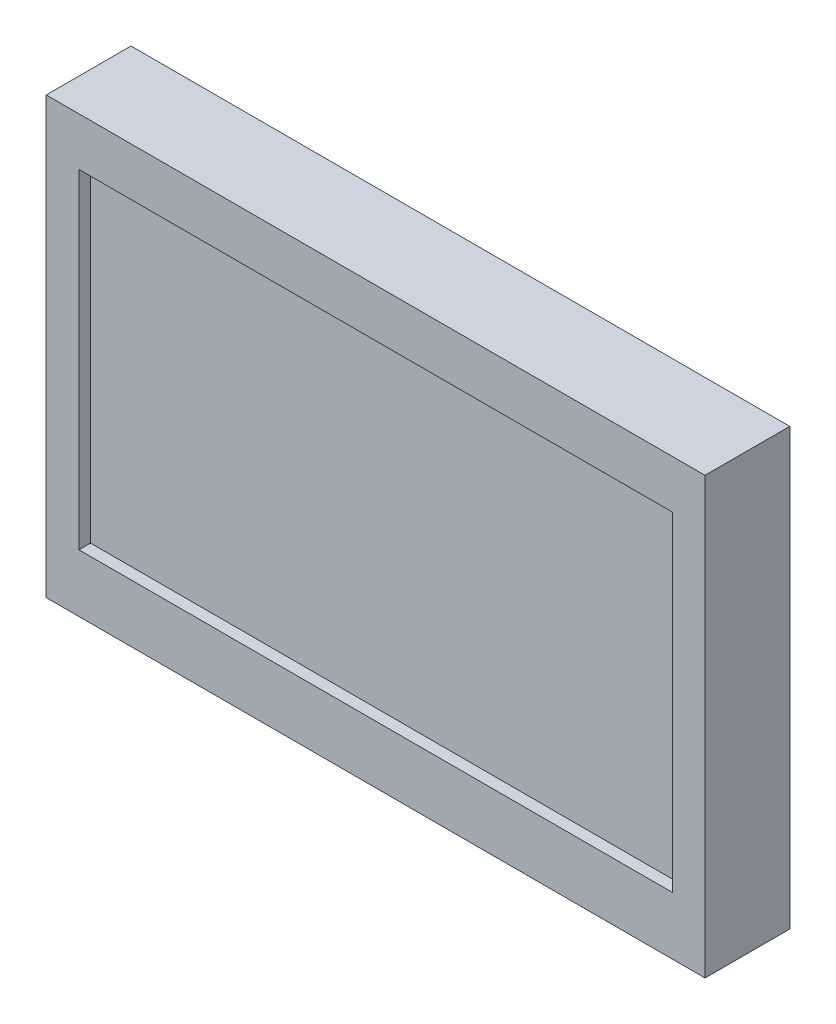
ISO-10303-21;
HEADER;
FILE_DESCRIPTION(('STEP AP214'),'2;1');
FILE_NAME('part.step','',(''),(''),'','','');
FILE_SCHEMA(('AUTOMOTIVE_DESIGN { 1 0 10303 214 1 1 1 1 }'));
ENDSEC;
DATA;
#1=APPLICATION_CONTEXT('core data for automotive mechanical design processes');
#2=APPLICATION_PROTOCOL_DEFINITION('international standard','automotive_design',2000,#1);
#3=PRODUCT_CONTEXT('',#1,'mechanical');
#4=PRODUCT('Part','Part','',(#3));
#5=PRODUCT_RELATED_PRODUCT_CATEGORY('part','',(#4));
#6=PRODUCT_DEFINITION_FORMATION('','',#4);
#7=PRODUCT_DEFINITION_CONTEXT('part definition',#1,'design');
#8=PRODUCT_DEFINITION('design','',#6,#7);
#9=PRODUCT_DEFINITION_SHAPE('','',#8);
#10=(LENGTH_UNIT() NAMED_UNIT(*) SI_UNIT(.MILLI.,.METRE.));
#11=(NAMED_UNIT(*) PLANE_ANGLE_UNIT() SI_UNIT($,.RADIAN.));
#12=(NAMED_UNIT(*) SI_UNIT($,.STERADIAN.) SOLID_ANGLE_UNIT());
#13=UNCERTAINTY_MEASURE_WITH_UNIT(LENGTH_MEASURE(1.E-05),#10,'distance_accuracy_value','');
#14=(GEOMETRIC_REPRESENTATION_CONTEXT(3) GLOBAL_UNCERTAINTY_ASSIGNED_CONTEXT((#13)) GLOBAL_UNIT_ASSIGNED_CONTEXT((#10,
#11,#12)) REPRESENTATION_CONTEXT('',''));
#15=CARTESIAN_POINT('',(0.,0.,0.));
#16=DIRECTION('',(0.,0.,1.));
#17=DIRECTION('',(1.,0.,0.));
#18=AXIS2_PLACEMENT_3D('',#15,#16,#17);
#19=CARTESIAN_POINT('',(0.,0.,22.));
#20=DIRECTION('',(0.,0.,1.));
#21=DIRECTION('',(1.,0.,0.));
#22=AXIS2_PLACEMENT_3D('',#19,#20,#21);
#23=PLANE('',#22);
#24=DIRECTION('',(0.,-1.,0.));
#25=VECTOR('',#24,1.);
#26=CARTESIAN_POINT('',(-85.5,-56.5,22.));
#27=LINE('',#26,#25);
#28=CARTESIAN_POINT('',(-85.5,56.5,22.));
#29=VERTEX_POINT('',#28);
#30=CARTESIAN_POINT('',(-85.5,-56.5,22.));
#31=VERTEX_POINT('',#30);
#32=EDGE_CURVE('E151',#29,#31,#27,.T.);
#33=ORIENTED_EDGE('',*,*,#32,.T.);
#34=DIRECTION('',(1.,0.,0.));
#35=VECTOR('',#34,1.);
#36=CARTESIAN_POINT('',(85.5,-56.5,22.));
#37=LINE('',#36,#35);
#38=CARTESIAN_POINT('',(85.5,-56.5,22.));
#39=VERTEX_POINT('',#38);
#40=EDGE_CURVE('E88',#31,#39,#37,.T.);
#41=ORIENTED_EDGE('',*,*,#40,.T.);
#42=DIRECTION('',(0.,1.,0.));
#43=VECTOR('',#42,1.);
#44=CARTESIAN_POINT('',(85.5,-56.5,22.));
#45=LINE('',#44,#43);
#46=CARTESIAN_POINT('',(85.5,56.5,22.));
#47=VERTEX_POINT('',#46);
#48=EDGE_CURVE('E154',#39,#47,#45,.T.);
#49=ORIENTED_EDGE('',*,*,#48,.T.);
#50=DIRECTION('',(-1.,0.,0.));
#51=VECTOR('',#50,1.);
#52=CARTESIAN_POINT('',(85.5,56.5,22.));
#53=LINE('',#52,#51);
#54=EDGE_CURVE('E60',#47,#29,#53,.T.);
#55=ORIENTED_EDGE('',*,*,#54,.T.);
#56=EDGE_LOOP('',(#33,#41,#49,#55));
#57=FACE_BOUND('',#56,.T.);
#58=DIRECTION('',(0.,1.,0.));
#59=VECTOR('',#58,1.);
#60=CARTESIAN_POINT('',(77.,0.,22.));
#61=LINE('',#60,#59);
#62=CARTESIAN_POINT('',(77.,-41.5,22.));
#63=VERTEX_POINT('',#62);
#64=CARTESIAN_POINT('',(77.,44.,22.));
#65=VERTEX_POINT('',#64);
#66=EDGE_CURVE('E137',#63,#65,#61,.T.);
#67=ORIENTED_EDGE('',*,*,#66,.F.);
#68=DIRECTION('',(-1.,0.,0.));
#69=VECTOR('',#68,1.);
#70=CARTESIAN_POINT('',(0.,-41.5,22.));
#71=LINE('',#70,#69);
#72=CARTESIAN_POINT('',(-77.,-41.5,22.));
#73=VERTEX_POINT('',#72);
#74=EDGE_CURVE('E51',#63,#73,#71,.T.);
#75=ORIENTED_EDGE('',*,*,#74,.T.);
#76=DIRECTION('',(0.,1.,0.));
#77=VECTOR('',#76,1.);
#78=CARTESIAN_POINT('',(-77.,0.,22.));
#79=LINE('',#78,#77);
#80=CARTESIAN_POINT('',(-77.,44.,22.));
#81=VERTEX_POINT('',#80);
#82=EDGE_CURVE('E126',#73,#81,#79,.T.);
#83=ORIENTED_EDGE('',*,*,#82,.T.);
#84=DIRECTION('',(-1.,0.,0.));
#85=VECTOR('',#84,1.);
#86=CARTESIAN_POINT('',(0.,44.,22.));
#87=LINE('',#86,#85);
#88=EDGE_CURVE('E140',#65,#81,#87,.T.);
#89=ORIENTED_EDGE('',*,*,#88,.F.);
#90=EDGE_LOOP('',(#67,#75,#83,#89));
#91=FACE_BOUND('',#90,.T.);
#92=ADVANCED_FACE('F36',(#57,#91),#23,.T.);
#93=CARTESIAN_POINT('',(-85.5,-56.5,22.));
#94=DIRECTION('',(1.,0.,0.));
#95=DIRECTION('',(0.,0.,-1.));
#96=AXIS2_PLACEMENT_3D('',#93,#94,#95);
#97=PLANE('',#96);
#98=DIRECTION('',(0.,-1.,0.));
#99=VECTOR('',#98,1.);
#100=CARTESIAN_POINT('',(-85.5,-56.5,0.));
#101=LINE('',#100,#99);
#102=CARTESIAN_POINT('',(-85.5,56.5,0.));
#103=VERTEX_POINT('',#102);
#104=CARTESIAN_POINT('',(-85.5,-56.5,0.));
#105=VERTEX_POINT('',#104);
#106=EDGE_CURVE('E147',#103,#105,#101,.T.);
#107=ORIENTED_EDGE('',*,*,#106,.T.);
#108=DIRECTION('',(0.,0.,-1.));
#109=VECTOR('',#108,1.);
#110=CARTESIAN_POINT('',(-85.5,-56.5,22.));
#111=LINE('',#110,#109);
#112=EDGE_CURVE('E11',#31,#105,#111,.T.);
#113=ORIENTED_EDGE('',*,*,#112,.F.);
#114=ORIENTED_EDGE('',*,*,#32,.F.);
#115=DIRECTION('',(0.,0.,-1.));
#116=VECTOR('',#115,1.);
#117=CARTESIAN_POINT('',(-85.5,56.5,22.));
#118=LINE('',#117,#116);
#119=EDGE_CURVE('E157',#29,#103,#118,.T.);
#120=ORIENTED_EDGE('',*,*,#119,.T.);
#121=EDGE_LOOP('',(#107,#113,#114,#120));
#122=FACE_BOUND('',#121,.T.);
#123=ADVANCED_FACE('F38',(#122),#97,.F.);
#124=CARTESIAN_POINT('',(85.5,-56.5,22.));
#125=DIRECTION('',(0.,1.,0.));
#126=DIRECTION('',(-1.,0.,0.));
#127=AXIS2_PLACEMENT_3D('',#124,#125,#126);
#128=PLANE('',#127);
#129=CARTESIAN_POINT('',(0.,-56.5,8.50000000000001));
#130=DIRECTION('',(0.,-1.,0.));
#131=DIRECTION('',(1.,0.,0.));
#132=AXIS2_PLACEMENT_3D('',#129,#130,#131);
#133=CIRCLE('',#132,2.75);
#134=CARTESIAN_POINT('',(2.75000000000001,-56.5,8.50000000000001));
#135=VERTEX_POINT('',#134);
#136=EDGE_CURVE('E221',#135,#135,#133,.T.);
#137=ORIENTED_EDGE('',*,*,#136,.F.);
#138=EDGE_LOOP('',(#137));
#139=FACE_BOUND('',#138,.T.);
#140=DIRECTION('',(1.,0.,0.));
#141=VECTOR('',#140,1.);
#142=CARTESIAN_POINT('',(85.5,-56.5,0.));
#143=LINE('',#142,#141);
#144=CARTESIAN_POINT('',(85.5,-56.5,0.));
#145=VERTEX_POINT('',#144);
#146=EDGE_CURVE('E160',#105,#145,#143,.T.);
#147=ORIENTED_EDGE('',*,*,#146,.T.);
#148=DIRECTION('',(0.,0.,-1.));
#149=VECTOR('',#148,1.);
#150=CARTESIAN_POINT('',(85.5,-56.5,22.));
#151=LINE('',#150,#149);
#152=EDGE_CURVE('E44',#39,#145,#151,.T.);
#153=ORIENTED_EDGE('',*,*,#152,.F.);
#154=ORIENTED_EDGE('',*,*,#40,.F.);
#155=ORIENTED_EDGE('',*,*,#112,.T.);
#156=EDGE_LOOP('',(#147,#153,#154,#155));
#157=FACE_BOUND('',#156,.T.);
#158=ADVANCED_FACE('F187',(#139,#157),#128,.F.);
#159=CARTESIAN_POINT('',(85.5,-56.5,22.));
#160=DIRECTION('',(-1.,0.,0.));
#161=DIRECTION('',(0.,0.,1.));
#162=AXIS2_PLACEMENT_3D('',#159,#160,#161);
#163=PLANE('',#162);
#164=DIRECTION('',(0.,1.,0.));
#165=VECTOR('',#164,1.);
#166=CARTESIAN_POINT('',(85.5,-56.5,0.));
#167=LINE('',#166,#165);
#168=CARTESIAN_POINT('',(85.5,56.5,0.));
#169=VERTEX_POINT('',#168);
#170=EDGE_CURVE('E162',#145,#169,#167,.T.);
#171=ORIENTED_EDGE('',*,*,#170,.T.);
#172=DIRECTION('',(0.,0.,-1.));
#173=VECTOR('',#172,1.);
#174=CARTESIAN_POINT('',(85.5,56.5,22.));
#175=LINE('',#174,#173);
#176=EDGE_CURVE('E166',#47,#169,#175,.T.);
#177=ORIENTED_EDGE('',*,*,#176,.F.);
#178=ORIENTED_EDGE('',*,*,#48,.F.);
#179=ORIENTED_EDGE('',*,*,#152,.T.);
#180=EDGE_LOOP('',(#171,#177,#178,#179));
#181=FACE_BOUND('',#180,.T.);
#182=ADVANCED_FACE('F171',(#181),#163,.F.);
#183=CARTESIAN_POINT('',(85.5,56.5,22.));
#184=DIRECTION('',(0.,-1.,0.));
#185=DIRECTION('',(1.,0.,0.));
#186=AXIS2_PLACEMENT_3D('',#183,#184,#185);
#187=PLANE('',#186);
#188=DIRECTION('',(-1.,0.,0.));
#189=VECTOR('',#188,1.);
#190=CARTESIAN_POINT('',(85.5,56.5,0.));
#191=LINE('',#190,#189);
#192=EDGE_CURVE('E81',#169,#103,#191,.T.);
#193=ORIENTED_EDGE('',*,*,#192,.T.);
#194=ORIENTED_EDGE('',*,*,#119,.F.);
#195=ORIENTED_EDGE('',*,*,#54,.F.);
#196=ORIENTED_EDGE('',*,*,#176,.T.);
#197=EDGE_LOOP('',(#193,#194,#195,#196));
#198=FACE_BOUND('',#197,.T.);
#199=ADVANCED_FACE('F179',(#198),#187,.F.);
#200=CARTESIAN_POINT('',(0.,0.,0.));
#201=DIRECTION('',(0.,0.,1.));
#202=DIRECTION('',(1.,0.,0.));
#203=AXIS2_PLACEMENT_3D('',#200,#201,#202);
#204=PLANE('',#203);
#205=ORIENTED_EDGE('',*,*,#106,.F.);
#206=ORIENTED_EDGE('',*,*,#192,.F.);
#207=ORIENTED_EDGE('',*,*,#170,.F.);
#208=ORIENTED_EDGE('',*,*,#146,.F.);
#209=EDGE_LOOP('',(#205,#206,#207,#208));
#210=FACE_BOUND('',#209,.T.);
#211=ADVANCED_FACE('F175',(#210),#204,.F.);
#212=CARTESIAN_POINT('',(0.,-41.5,19.));
#213=DIRECTION('',(0.,1.,0.));
#214=DIRECTION('',(0.,0.,1.));
#215=AXIS2_PLACEMENT_3D('',#212,#213,#214);
#216=PLANE('',#215);
#217=ORIENTED_EDGE('',*,*,#74,.F.);
#218=DIRECTION('',(0.,0.,1.));
#219=VECTOR('',#218,1.);
#220=CARTESIAN_POINT('',(77.,-41.5,19.));
#221=LINE('',#220,#219);
#222=CARTESIAN_POINT('',(77.,-41.5,19.));
#223=VERTEX_POINT('',#222);
#224=EDGE_CURVE('E109',#223,#63,#221,.T.);
#225=ORIENTED_EDGE('',*,*,#224,.F.);
#226=DIRECTION('',(-1.,0.,0.));
#227=VECTOR('',#226,1.);
#228=CARTESIAN_POINT('',(0.,-41.5,19.));
#229=LINE('',#228,#227);
#230=CARTESIAN_POINT('',(-77.,-41.5,19.));
#231=VERTEX_POINT('',#230);
#232=EDGE_CURVE('E112',#223,#231,#229,.T.);
#233=ORIENTED_EDGE('',*,*,#232,.T.);
#234=DIRECTION('',(0.,0.,1.));
#235=VECTOR('',#234,1.);
#236=CARTESIAN_POINT('',(-77.,-41.5,19.));
#237=LINE('',#236,#235);
#238=EDGE_CURVE('E145',#231,#73,#237,.T.);
#239=ORIENTED_EDGE('',*,*,#238,.T.);
#240=EDGE_LOOP('',(#217,#225,#233,#239));
#241=FACE_BOUND('',#240,.T.);
#242=ADVANCED_FACE('F111',(#241),#216,.T.);
#243=CARTESIAN_POINT('',(-77.,0.,19.));
#244=DIRECTION('',(1.,0.,0.));
#245=DIRECTION('',(0.,0.,-1.));
#246=AXIS2_PLACEMENT_3D('',#243,#244,#245);
#247=PLANE('',#246);
#248=ORIENTED_EDGE('',*,*,#82,.F.);
#249=ORIENTED_EDGE('',*,*,#238,.F.);
#250=DIRECTION('',(0.,1.,0.));
#251=VECTOR('',#250,1.);
#252=CARTESIAN_POINT('',(-77.,0.,19.));
#253=LINE('',#252,#251);
#254=CARTESIAN_POINT('',(-77.,44.,19.));
#255=VERTEX_POINT('',#254);
#256=EDGE_CURVE('E119',#231,#255,#253,.T.);
#257=ORIENTED_EDGE('',*,*,#256,.T.);
#258=DIRECTION('',(0.,0.,1.));
#259=VECTOR('',#258,1.);
#260=CARTESIAN_POINT('',(-77.,44.,19.));
#261=LINE('',#260,#259);
#262=EDGE_CURVE('E148',#255,#81,#261,.T.);
#263=ORIENTED_EDGE('',*,*,#262,.T.);
#264=EDGE_LOOP('',(#248,#249,#257,#263));
#265=FACE_BOUND('',#264,.T.);
#266=ADVANCED_FACE('F198',(#265),#247,.T.);
#267=CARTESIAN_POINT('',(0.,44.,19.));
#268=DIRECTION('',(0.,1.,0.));
#269=DIRECTION('',(0.,0.,1.));
#270=AXIS2_PLACEMENT_3D('',#267,#268,#269);
#271=PLANE('',#270);
#272=ORIENTED_EDGE('',*,*,#88,.T.);
#273=ORIENTED_EDGE('',*,*,#262,.F.);
#274=DIRECTION('',(-1.,0.,0.));
#275=VECTOR('',#274,1.);
#276=CARTESIAN_POINT('',(0.,44.,19.));
#277=LINE('',#276,#275);
#278=CARTESIAN_POINT('',(77.,44.,19.));
#279=VERTEX_POINT('',#278);
#280=EDGE_CURVE('E130',#279,#255,#277,.T.);
#281=ORIENTED_EDGE('',*,*,#280,.F.);
#282=DIRECTION('',(0.,0.,1.));
#283=VECTOR('',#282,1.);
#284=CARTESIAN_POINT('',(77.,44.,19.));
#285=LINE('',#284,#283);
#286=EDGE_CURVE('E118',#279,#65,#285,.T.);
#287=ORIENTED_EDGE('',*,*,#286,.T.);
#288=EDGE_LOOP('',(#272,#273,#281,#287));
#289=FACE_BOUND('',#288,.T.);
#290=ADVANCED_FACE('F201',(#289),#271,.F.);
#291=CARTESIAN_POINT('',(77.,0.,19.));
#292=DIRECTION('',(1.,0.,0.));
#293=DIRECTION('',(0.,0.,-1.));
#294=AXIS2_PLACEMENT_3D('',#291,#292,#293);
#295=PLANE('',#294);
#296=ORIENTED_EDGE('',*,*,#66,.T.);
#297=ORIENTED_EDGE('',*,*,#286,.F.);
#298=DIRECTION('',(0.,1.,0.));
#299=VECTOR('',#298,1.);
#300=CARTESIAN_POINT('',(77.,0.,19.));
#301=LINE('',#300,#299);
#302=EDGE_CURVE('E125',#223,#279,#301,.T.);
#303=ORIENTED_EDGE('',*,*,#302,.F.);
#304=ORIENTED_EDGE('',*,*,#224,.T.);
#305=EDGE_LOOP('',(#296,#297,#303,#304));
#306=FACE_BOUND('',#305,.T.);
#307=ADVANCED_FACE('F128',(#306),#295,.F.);
#308=CARTESIAN_POINT('',(0.,0.,19.));
#309=DIRECTION('',(0.,0.,1.));
#310=DIRECTION('',(1.,0.,0.));
#311=AXIS2_PLACEMENT_3D('',#308,#309,#310);
#312=PLANE('',#311);
#313=ORIENTED_EDGE('',*,*,#232,.F.);
#314=ORIENTED_EDGE('',*,*,#302,.T.);
#315=ORIENTED_EDGE('',*,*,#280,.T.);
#316=ORIENTED_EDGE('',*,*,#256,.F.);
#317=EDGE_LOOP('',(#313,#314,#315,#316));
#318=FACE_BOUND('',#317,.T.);
#319=ADVANCED_FACE('F123',(#318),#312,.T.);
#320=CARTESIAN_POINT('',(0.,-46.5,8.50000000000001));
#321=DIRECTION('',(0.,-1.,0.));
#322=DIRECTION('',(1.,0.,0.));
#323=AXIS2_PLACEMENT_3D('',#320,#321,#322);
#324=CYLINDRICAL_SURFACE('',#323,2.75);
#325=CARTESIAN_POINT('',(0.,-46.5,8.50000000000001));
#326=DIRECTION('',(0.,-1.,0.));
#327=DIRECTION('',(1.,0.,0.));
#328=AXIS2_PLACEMENT_3D('',#325,#326,#327);
#329=CIRCLE('',#328,2.75);
#330=CARTESIAN_POINT('',(2.75000000000001,-46.5,8.50000000000001));
#331=VERTEX_POINT('',#330);
#332=EDGE_CURVE('E138',#331,#331,#329,.T.);
#333=ORIENTED_EDGE('',*,*,#332,.F.);
#334=EDGE_LOOP('',(#333));
#335=FACE_BOUND('',#334,.T.);
#336=ORIENTED_EDGE('',*,*,#136,.T.);
#337=EDGE_LOOP('',(#336));
#338=FACE_BOUND('',#337,.T.);
#339=ADVANCED_FACE('F210',(#335,#338),#324,.F.);
#340=CARTESIAN_POINT('',(0.,-46.5,0.));
#341=DIRECTION('',(0.,-1.,0.));
#342=DIRECTION('',(1.,0.,0.));
#343=AXIS2_PLACEMENT_3D('',#340,#341,#342);
#344=PLANE('',#343);
#345=ORIENTED_EDGE('',*,*,#332,.T.);
#346=EDGE_LOOP('',(#345));
#347=FACE_BOUND('',#346,.T.);
#348=ADVANCED_FACE('F213',(#347),#344,.T.);
#349=CLOSED_SHELL('',(#92,#123,#158,#182,#199,#211,#242,#266,#290,#307,#319,#339,#348));
#350=MANIFOLD_SOLID_BREP('B2',#349);
#351=ADVANCED_BREP_SHAPE_REPRESENTATION('',(#18,#350),#14);
#352=SHAPE_DEFINITION_REPRESENTATION(#9,#351);
ENDSEC;
END-ISO-10303-21;
